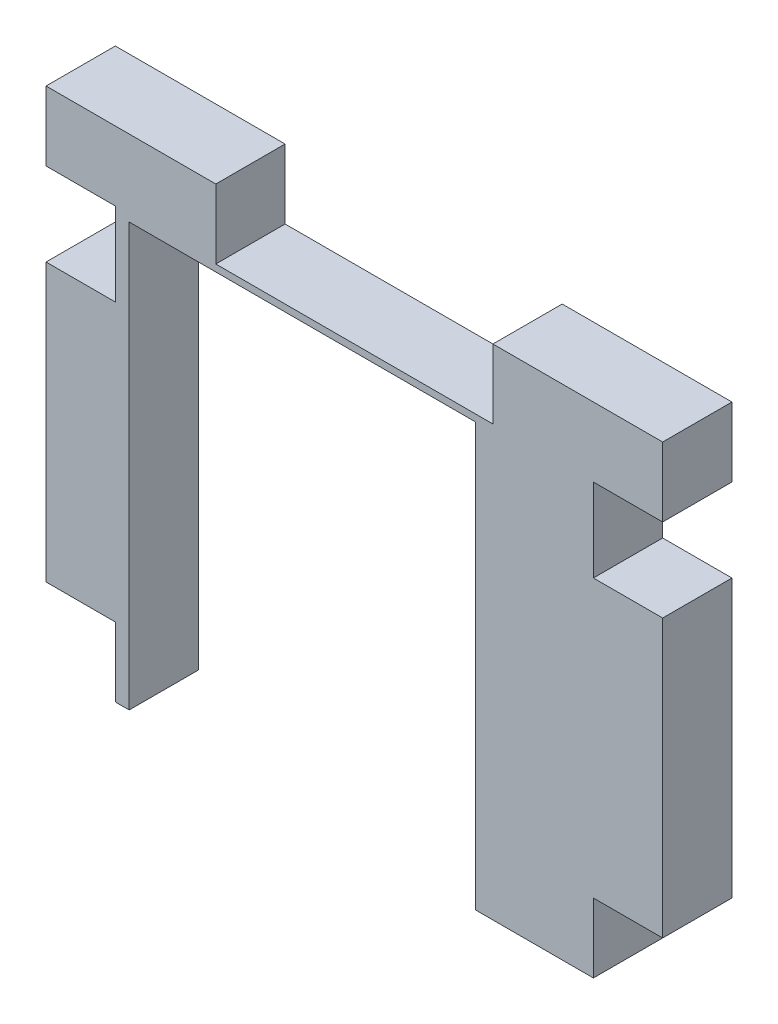
ISO-10303-21;
HEADER;
FILE_DESCRIPTION(('STEP AP214'),'2;1');
FILE_NAME('part.step','',(''),(''),'','','');
FILE_SCHEMA(('AUTOMOTIVE_DESIGN { 1 0 10303 214 1 1 1 1 }'));
ENDSEC;
DATA;
#1=APPLICATION_CONTEXT('core data for automotive mechanical design processes');
#2=APPLICATION_PROTOCOL_DEFINITION('international standard','automotive_design',2000,#1);
#3=PRODUCT_CONTEXT('',#1,'mechanical');
#4=PRODUCT('Part','Part','',(#3));
#5=PRODUCT_RELATED_PRODUCT_CATEGORY('part','',(#4));
#6=PRODUCT_DEFINITION_FORMATION('','',#4);
#7=PRODUCT_DEFINITION_CONTEXT('part definition',#1,'design');
#8=PRODUCT_DEFINITION('design','',#6,#7);
#9=PRODUCT_DEFINITION_SHAPE('','',#8);
#10=(LENGTH_UNIT() NAMED_UNIT(*) SI_UNIT(.MILLI.,.METRE.));
#11=(NAMED_UNIT(*) PLANE_ANGLE_UNIT() SI_UNIT($,.RADIAN.));
#12=(NAMED_UNIT(*) SI_UNIT($,.STERADIAN.) SOLID_ANGLE_UNIT());
#13=UNCERTAINTY_MEASURE_WITH_UNIT(LENGTH_MEASURE(1.E-05),#10,'distance_accuracy_value','');
#14=(GEOMETRIC_REPRESENTATION_CONTEXT(3) GLOBAL_UNCERTAINTY_ASSIGNED_CONTEXT((#13)) GLOBAL_UNIT_ASSIGNED_CONTEXT((#10,
#11,#12)) REPRESENTATION_CONTEXT('',''));
#15=CARTESIAN_POINT('',(0.,0.,0.));
#16=DIRECTION('',(0.,0.,1.));
#17=DIRECTION('',(1.,0.,0.));
#18=AXIS2_PLACEMENT_3D('',#15,#16,#17);
#19=CARTESIAN_POINT('',(0.,10.,5.));
#20=DIRECTION('',(0.,1.,0.));
#21=DIRECTION('',(0.,0.,1.));
#22=AXIS2_PLACEMENT_3D('',#19,#20,#21);
#23=PLANE('',#22);
#24=DIRECTION('',(1.,0.,0.));
#25=VECTOR('',#24,1.);
#26=CARTESIAN_POINT('',(0.,10.,0.));
#27=LINE('',#26,#25);
#28=CARTESIAN_POINT('',(0.,10.,0.));
#29=VERTEX_POINT('',#28);
#30=CARTESIAN_POINT('',(5.,10.,0.));
#31=VERTEX_POINT('',#30);
#32=EDGE_CURVE('E227',#29,#31,#27,.T.);
#33=ORIENTED_EDGE('',*,*,#32,.T.);
#34=DIRECTION('',(0.,0.,-1.));
#35=VECTOR('',#34,1.);
#36=CARTESIAN_POINT('',(5.,10.,5.));
#37=LINE('',#36,#35);
#38=CARTESIAN_POINT('',(5.,10.,5.));
#39=VERTEX_POINT('',#38);
#40=EDGE_CURVE('E11',#39,#31,#37,.T.);
#41=ORIENTED_EDGE('',*,*,#40,.F.);
#42=DIRECTION('',(1.,0.,0.));
#43=VECTOR('',#42,1.);
#44=CARTESIAN_POINT('',(0.,10.,5.));
#45=LINE('',#44,#43);
#46=CARTESIAN_POINT('',(0.,10.,5.));
#47=VERTEX_POINT('',#46);
#48=EDGE_CURVE('E289',#47,#39,#45,.T.);
#49=ORIENTED_EDGE('',*,*,#48,.F.);
#50=DIRECTION('',(0.,0.,-1.));
#51=VECTOR('',#50,1.);
#52=CARTESIAN_POINT('',(0.,10.,5.));
#53=LINE('',#52,#51);
#54=EDGE_CURVE('E50',#47,#29,#53,.T.);
#55=ORIENTED_EDGE('',*,*,#54,.T.);
#56=EDGE_LOOP('',(#33,#41,#49,#55));
#57=FACE_BOUND('',#56,.T.);
#58=ADVANCED_FACE('F34',(#57),#23,.F.);
#59=CARTESIAN_POINT('',(5.,0.,5.));
#60=DIRECTION('',(1.,0.,0.));
#61=DIRECTION('',(0.,0.,-1.));
#62=AXIS2_PLACEMENT_3D('',#59,#60,#61);
#63=PLANE('',#62);
#64=DIRECTION('',(0.,-1.,0.));
#65=VECTOR('',#64,1.);
#66=CARTESIAN_POINT('',(5.,0.,0.));
#67=LINE('',#66,#65);
#68=CARTESIAN_POINT('',(5.,5.,0.));
#69=VERTEX_POINT('',#68);
#70=EDGE_CURVE('E229',#31,#69,#67,.T.);
#71=ORIENTED_EDGE('',*,*,#70,.T.);
#72=DIRECTION('',(0.,0.,-1.));
#73=VECTOR('',#72,1.);
#74=CARTESIAN_POINT('',(5.,5.,5.));
#75=LINE('',#74,#73);
#76=CARTESIAN_POINT('',(5.,5.,5.));
#77=VERTEX_POINT('',#76);
#78=EDGE_CURVE('E42',#77,#69,#75,.T.);
#79=ORIENTED_EDGE('',*,*,#78,.F.);
#80=DIRECTION('',(0.,-1.,0.));
#81=VECTOR('',#80,1.);
#82=CARTESIAN_POINT('',(5.,0.,5.));
#83=LINE('',#82,#81);
#84=EDGE_CURVE('E136',#39,#77,#83,.T.);
#85=ORIENTED_EDGE('',*,*,#84,.F.);
#86=ORIENTED_EDGE('',*,*,#40,.T.);
#87=EDGE_LOOP('',(#71,#79,#85,#86));
#88=FACE_BOUND('',#87,.T.);
#89=ADVANCED_FACE('F406',(#88),#63,.F.);
#90=CARTESIAN_POINT('',(0.,5.,5.));
#91=DIRECTION('',(0.,1.,0.));
#92=DIRECTION('',(0.,0.,1.));
#93=AXIS2_PLACEMENT_3D('',#90,#91,#92);
#94=PLANE('',#93);
#95=DIRECTION('',(1.,0.,0.));
#96=VECTOR('',#95,1.);
#97=CARTESIAN_POINT('',(0.,5.,0.));
#98=LINE('',#97,#96);
#99=CARTESIAN_POINT('',(6.00000000000001,5.,0.));
#100=VERTEX_POINT('',#99);
#101=EDGE_CURVE('E231',#69,#100,#98,.T.);
#102=ORIENTED_EDGE('',*,*,#101,.T.);
#103=DIRECTION('',(0.,0.,-1.));
#104=VECTOR('',#103,1.);
#105=CARTESIAN_POINT('',(6.00000000000001,5.,5.));
#106=LINE('',#105,#104);
#107=CARTESIAN_POINT('',(6.00000000000001,5.,5.));
#108=VERTEX_POINT('',#107);
#109=EDGE_CURVE('E330',#108,#100,#106,.T.);
#110=ORIENTED_EDGE('',*,*,#109,.F.);
#111=DIRECTION('',(1.,0.,0.));
#112=VECTOR('',#111,1.);
#113=CARTESIAN_POINT('',(0.,5.,5.));
#114=LINE('',#113,#112);
#115=EDGE_CURVE('E337',#77,#108,#114,.T.);
#116=ORIENTED_EDGE('',*,*,#115,.F.);
#117=ORIENTED_EDGE('',*,*,#78,.T.);
#118=EDGE_LOOP('',(#102,#110,#116,#117));
#119=FACE_BOUND('',#118,.T.);
#120=ADVANCED_FACE('F335',(#119),#94,.F.);
#121=CARTESIAN_POINT('',(6.00000000000001,0.,5.));
#122=DIRECTION('',(1.,0.,0.));
#123=DIRECTION('',(0.,1.,0.));
#124=AXIS2_PLACEMENT_3D('',#121,#122,#123);
#125=PLANE('',#124);
#126=DIRECTION('',(0.,-1.,0.));
#127=VECTOR('',#126,1.);
#128=CARTESIAN_POINT('',(6.00000000000001,0.,0.));
#129=LINE('',#128,#127);
#130=CARTESIAN_POINT('',(6.,35.5,0.));
#131=VERTEX_POINT('',#130);
#132=EDGE_CURVE('E234',#131,#100,#129,.T.);
#133=ORIENTED_EDGE('',*,*,#132,.F.);
#134=DIRECTION('',(0.,0.,-1.));
#135=VECTOR('',#134,1.);
#136=CARTESIAN_POINT('',(6.,35.5,5.));
#137=LINE('',#136,#135);
#138=CARTESIAN_POINT('',(6.,35.5,5.));
#139=VERTEX_POINT('',#138);
#140=EDGE_CURVE('E328',#139,#131,#137,.T.);
#141=ORIENTED_EDGE('',*,*,#140,.F.);
#142=DIRECTION('',(0.,-1.,0.));
#143=VECTOR('',#142,1.);
#144=CARTESIAN_POINT('',(6.00000000000001,0.,5.));
#145=LINE('',#144,#143);
#146=EDGE_CURVE('E347',#139,#108,#145,.T.);
#147=ORIENTED_EDGE('',*,*,#146,.T.);
#148=ORIENTED_EDGE('',*,*,#109,.T.);
#149=EDGE_LOOP('',(#133,#141,#147,#148));
#150=FACE_BOUND('',#149,.T.);
#151=ADVANCED_FACE('F344',(#150),#125,.T.);
#152=CARTESIAN_POINT('',(0.,35.5,5.));
#153=DIRECTION('',(0.,-1.,0.));
#154=DIRECTION('',(1.,0.,0.));
#155=AXIS2_PLACEMENT_3D('',#152,#153,#154);
#156=PLANE('',#155);
#157=DIRECTION('',(-1.,0.,0.));
#158=VECTOR('',#157,1.);
#159=CARTESIAN_POINT('',(0.,35.5,0.));
#160=LINE('',#159,#158);
#161=CARTESIAN_POINT('',(31.,35.5,0.));
#162=VERTEX_POINT('',#161);
#163=EDGE_CURVE('E237',#162,#131,#160,.T.);
#164=ORIENTED_EDGE('',*,*,#163,.F.);
#165=DIRECTION('',(0.,0.,-1.));
#166=VECTOR('',#165,1.);
#167=CARTESIAN_POINT('',(31.,35.5,5.));
#168=LINE('',#167,#166);
#169=CARTESIAN_POINT('',(31.,35.5,5.));
#170=VERTEX_POINT('',#169);
#171=EDGE_CURVE('E326',#170,#162,#168,.T.);
#172=ORIENTED_EDGE('',*,*,#171,.F.);
#173=DIRECTION('',(-1.,0.,0.));
#174=VECTOR('',#173,1.);
#175=CARTESIAN_POINT('',(0.,35.5,5.));
#176=LINE('',#175,#174);
#177=EDGE_CURVE('E350',#170,#139,#176,.T.);
#178=ORIENTED_EDGE('',*,*,#177,.T.);
#179=ORIENTED_EDGE('',*,*,#140,.T.);
#180=EDGE_LOOP('',(#164,#172,#178,#179));
#181=FACE_BOUND('',#180,.T.);
#182=ADVANCED_FACE('F419',(#181),#156,.T.);
#183=CARTESIAN_POINT('',(31.,0.,5.));
#184=DIRECTION('',(1.,0.,0.));
#185=DIRECTION('',(0.,0.,-1.));
#186=AXIS2_PLACEMENT_3D('',#183,#184,#185);
#187=PLANE('',#186);
#188=DIRECTION('',(0.,-1.,0.));
#189=VECTOR('',#188,1.);
#190=CARTESIAN_POINT('',(31.,0.,0.));
#191=LINE('',#190,#189);
#192=CARTESIAN_POINT('',(31.,5.,0.));
#193=VERTEX_POINT('',#192);
#194=EDGE_CURVE('E240',#162,#193,#191,.T.);
#195=ORIENTED_EDGE('',*,*,#194,.T.);
#196=DIRECTION('',(0.,0.,-1.));
#197=VECTOR('',#196,1.);
#198=CARTESIAN_POINT('',(31.,5.,5.));
#199=LINE('',#198,#197);
#200=CARTESIAN_POINT('',(31.,5.,5.));
#201=VERTEX_POINT('',#200);
#202=EDGE_CURVE('E323',#201,#193,#199,.T.);
#203=ORIENTED_EDGE('',*,*,#202,.F.);
#204=DIRECTION('',(0.,-1.,0.));
#205=VECTOR('',#204,1.);
#206=CARTESIAN_POINT('',(31.,0.,5.));
#207=LINE('',#206,#205);
#208=EDGE_CURVE('E352',#170,#201,#207,.T.);
#209=ORIENTED_EDGE('',*,*,#208,.F.);
#210=ORIENTED_EDGE('',*,*,#171,.T.);
#211=EDGE_LOOP('',(#195,#203,#209,#210));
#212=FACE_BOUND('',#211,.T.);
#213=ADVANCED_FACE('F422',(#212),#187,.F.);
#214=CARTESIAN_POINT('',(0.,5.,5.));
#215=DIRECTION('',(0.,1.,0.));
#216=DIRECTION('',(0.,0.,1.));
#217=AXIS2_PLACEMENT_3D('',#214,#215,#216);
#218=PLANE('',#217);
#219=DIRECTION('',(1.,0.,0.));
#220=VECTOR('',#219,1.);
#221=CARTESIAN_POINT('',(0.,5.,0.));
#222=LINE('',#221,#220);
#223=CARTESIAN_POINT('',(39.5,5.,0.));
#224=VERTEX_POINT('',#223);
#225=EDGE_CURVE('E242',#193,#224,#222,.T.);
#226=ORIENTED_EDGE('',*,*,#225,.T.);
#227=DIRECTION('',(0.,0.,-1.));
#228=VECTOR('',#227,1.);
#229=CARTESIAN_POINT('',(39.5,5.,5.));
#230=LINE('',#229,#228);
#231=CARTESIAN_POINT('',(39.5,5.,5.));
#232=VERTEX_POINT('',#231);
#233=EDGE_CURVE('E321',#232,#224,#230,.T.);
#234=ORIENTED_EDGE('',*,*,#233,.F.);
#235=DIRECTION('',(1.,0.,0.));
#236=VECTOR('',#235,1.);
#237=CARTESIAN_POINT('',(0.,5.,5.));
#238=LINE('',#237,#236);
#239=EDGE_CURVE('E358',#201,#232,#238,.T.);
#240=ORIENTED_EDGE('',*,*,#239,.F.);
#241=ORIENTED_EDGE('',*,*,#202,.T.);
#242=EDGE_LOOP('',(#226,#234,#240,#241));
#243=FACE_BOUND('',#242,.T.);
#244=ADVANCED_FACE('F426',(#243),#218,.F.);
#245=CARTESIAN_POINT('',(39.5,0.,5.));
#246=DIRECTION('',(1.,0.,0.));
#247=DIRECTION('',(0.,0.,-1.));
#248=AXIS2_PLACEMENT_3D('',#245,#246,#247);
#249=PLANE('',#248);
#250=DIRECTION('',(0.,-1.,0.));
#251=VECTOR('',#250,1.);
#252=CARTESIAN_POINT('',(39.5,0.,0.));
#253=LINE('',#252,#251);
#254=CARTESIAN_POINT('',(39.5,10.,0.));
#255=VERTEX_POINT('',#254);
#256=EDGE_CURVE('E245',#255,#224,#253,.T.);
#257=ORIENTED_EDGE('',*,*,#256,.F.);
#258=DIRECTION('',(0.,0.,-1.));
#259=VECTOR('',#258,1.);
#260=CARTESIAN_POINT('',(39.5,10.,5.));
#261=LINE('',#260,#259);
#262=CARTESIAN_POINT('',(39.5,10.,5.));
#263=VERTEX_POINT('',#262);
#264=EDGE_CURVE('E319',#263,#255,#261,.T.);
#265=ORIENTED_EDGE('',*,*,#264,.F.);
#266=DIRECTION('',(0.,-1.,0.));
#267=VECTOR('',#266,1.);
#268=CARTESIAN_POINT('',(39.5,0.,5.));
#269=LINE('',#268,#267);
#270=EDGE_CURVE('E360',#263,#232,#269,.T.);
#271=ORIENTED_EDGE('',*,*,#270,.T.);
#272=ORIENTED_EDGE('',*,*,#233,.T.);
#273=EDGE_LOOP('',(#257,#265,#271,#272));
#274=FACE_BOUND('',#273,.T.);
#275=ADVANCED_FACE('F430',(#274),#249,.T.);
#276=CARTESIAN_POINT('',(0.,10.,5.));
#277=DIRECTION('',(0.,-1.,0.));
#278=DIRECTION('',(0.,0.,-1.));
#279=AXIS2_PLACEMENT_3D('',#276,#277,#278);
#280=PLANE('',#279);
#281=DIRECTION('',(-1.,0.,0.));
#282=VECTOR('',#281,1.);
#283=CARTESIAN_POINT('',(0.,10.,0.));
#284=LINE('',#283,#282);
#285=CARTESIAN_POINT('',(44.5,10.,0.));
#286=VERTEX_POINT('',#285);
#287=EDGE_CURVE('E248',#286,#255,#284,.T.);
#288=ORIENTED_EDGE('',*,*,#287,.F.);
#289=DIRECTION('',(0.,0.,-1.));
#290=VECTOR('',#289,1.);
#291=CARTESIAN_POINT('',(44.5,10.,5.));
#292=LINE('',#291,#290);
#293=CARTESIAN_POINT('',(44.5,10.,5.));
#294=VERTEX_POINT('',#293);
#295=EDGE_CURVE('E317',#294,#286,#292,.T.);
#296=ORIENTED_EDGE('',*,*,#295,.F.);
#297=DIRECTION('',(-1.,0.,0.));
#298=VECTOR('',#297,1.);
#299=CARTESIAN_POINT('',(0.,10.,5.));
#300=LINE('',#299,#298);
#301=EDGE_CURVE('E363',#294,#263,#300,.T.);
#302=ORIENTED_EDGE('',*,*,#301,.T.);
#303=ORIENTED_EDGE('',*,*,#264,.T.);
#304=EDGE_LOOP('',(#288,#296,#302,#303));
#305=FACE_BOUND('',#304,.T.);
#306=ADVANCED_FACE('F432',(#305),#280,.T.);
#307=CARTESIAN_POINT('',(44.5,0.,5.));
#308=DIRECTION('',(-1.,0.,0.));
#309=DIRECTION('',(0.,0.,1.));
#310=AXIS2_PLACEMENT_3D('',#307,#308,#309);
#311=PLANE('',#310);
#312=DIRECTION('',(0.,1.,0.));
#313=VECTOR('',#312,1.);
#314=CARTESIAN_POINT('',(44.5,0.,0.));
#315=LINE('',#314,#313);
#316=CARTESIAN_POINT('',(44.5,30.,0.));
#317=VERTEX_POINT('',#316);
#318=EDGE_CURVE('E252',#286,#317,#315,.T.);
#319=ORIENTED_EDGE('',*,*,#318,.T.);
#320=DIRECTION('',(0.,0.,-1.));
#321=VECTOR('',#320,1.);
#322=CARTESIAN_POINT('',(44.5,30.,5.));
#323=LINE('',#322,#321);
#324=CARTESIAN_POINT('',(44.5,30.,5.));
#325=VERTEX_POINT('',#324);
#326=EDGE_CURVE('E314',#325,#317,#323,.T.);
#327=ORIENTED_EDGE('',*,*,#326,.F.);
#328=DIRECTION('',(0.,1.,0.));
#329=VECTOR('',#328,1.);
#330=CARTESIAN_POINT('',(44.5,0.,5.));
#331=LINE('',#330,#329);
#332=EDGE_CURVE('E367',#294,#325,#331,.T.);
#333=ORIENTED_EDGE('',*,*,#332,.F.);
#334=ORIENTED_EDGE('',*,*,#295,.T.);
#335=EDGE_LOOP('',(#319,#327,#333,#334));
#336=FACE_BOUND('',#335,.T.);
#337=ADVANCED_FACE('F435',(#336),#311,.F.);
#338=CARTESIAN_POINT('',(0.,30.,5.));
#339=DIRECTION('',(0.,-1.,0.));
#340=DIRECTION('',(0.,0.,-1.));
#341=AXIS2_PLACEMENT_3D('',#338,#339,#340);
#342=PLANE('',#341);
#343=DIRECTION('',(-1.,0.,0.));
#344=VECTOR('',#343,1.);
#345=CARTESIAN_POINT('',(0.,30.,0.));
#346=LINE('',#345,#344);
#347=CARTESIAN_POINT('',(39.5,30.,0.));
#348=VERTEX_POINT('',#347);
#349=EDGE_CURVE('E254',#317,#348,#346,.T.);
#350=ORIENTED_EDGE('',*,*,#349,.T.);
#351=DIRECTION('',(0.,0.,-1.));
#352=VECTOR('',#351,1.);
#353=CARTESIAN_POINT('',(39.5,30.,5.));
#354=LINE('',#353,#352);
#355=CARTESIAN_POINT('',(39.5,30.,5.));
#356=VERTEX_POINT('',#355);
#357=EDGE_CURVE('E312',#356,#348,#354,.T.);
#358=ORIENTED_EDGE('',*,*,#357,.F.);
#359=DIRECTION('',(-1.,0.,0.));
#360=VECTOR('',#359,1.);
#361=CARTESIAN_POINT('',(0.,30.,5.));
#362=LINE('',#361,#360);
#363=EDGE_CURVE('E369',#325,#356,#362,.T.);
#364=ORIENTED_EDGE('',*,*,#363,.F.);
#365=ORIENTED_EDGE('',*,*,#326,.T.);
#366=EDGE_LOOP('',(#350,#358,#364,#365));
#367=FACE_BOUND('',#366,.T.);
#368=ADVANCED_FACE('F439',(#367),#342,.F.);
#369=CARTESIAN_POINT('',(39.5,36.,0.));
#370=VERTEX_POINT('',#369);
#371=EDGE_CURVE('E249',#370,#348,#253,.T.);
#372=ORIENTED_EDGE('',*,*,#371,.F.);
#373=DIRECTION('',(0.,0.,-1.));
#374=VECTOR('',#373,1.);
#375=CARTESIAN_POINT('',(39.5,36.,5.));
#376=LINE('',#375,#374);
#377=CARTESIAN_POINT('',(39.5,36.,5.));
#378=VERTEX_POINT('',#377);
#379=EDGE_CURVE('E310',#378,#370,#376,.T.);
#380=ORIENTED_EDGE('',*,*,#379,.F.);
#381=EDGE_CURVE('E364',#378,#356,#269,.T.);
#382=ORIENTED_EDGE('',*,*,#381,.T.);
#383=ORIENTED_EDGE('',*,*,#357,.T.);
#384=EDGE_LOOP('',(#372,#380,#382,#383));
#385=FACE_BOUND('',#384,.T.);
#386=ADVANCED_FACE('F443',(#385),#249,.T.);
#387=CARTESIAN_POINT('',(0.,36.,5.));
#388=DIRECTION('',(0.,1.,0.));
#389=DIRECTION('',(0.,0.,1.));
#390=AXIS2_PLACEMENT_3D('',#387,#388,#389);
#391=PLANE('',#390);
#392=DIRECTION('',(1.,0.,0.));
#393=VECTOR('',#392,1.);
#394=CARTESIAN_POINT('',(0.,36.,0.));
#395=LINE('',#394,#393);
#396=CARTESIAN_POINT('',(44.5,36.,0.));
#397=VERTEX_POINT('',#396);
#398=EDGE_CURVE('E257',#370,#397,#395,.T.);
#399=ORIENTED_EDGE('',*,*,#398,.T.);
#400=DIRECTION('',(0.,0.,-1.));
#401=VECTOR('',#400,1.);
#402=CARTESIAN_POINT('',(44.5,36.,5.));
#403=LINE('',#402,#401);
#404=CARTESIAN_POINT('',(44.5,36.,5.));
#405=VERTEX_POINT('',#404);
#406=EDGE_CURVE('E307',#405,#397,#403,.T.);
#407=ORIENTED_EDGE('',*,*,#406,.F.);
#408=DIRECTION('',(1.,0.,0.));
#409=VECTOR('',#408,1.);
#410=CARTESIAN_POINT('',(0.,36.,5.));
#411=LINE('',#410,#409);
#412=EDGE_CURVE('E371',#378,#405,#411,.T.);
#413=ORIENTED_EDGE('',*,*,#412,.F.);
#414=ORIENTED_EDGE('',*,*,#379,.T.);
#415=EDGE_LOOP('',(#399,#407,#413,#414));
#416=FACE_BOUND('',#415,.T.);
#417=ADVANCED_FACE('F447',(#416),#391,.F.);
#418=CARTESIAN_POINT('',(44.5,0.,5.));
#419=DIRECTION('',(-1.,0.,0.));
#420=DIRECTION('',(0.,0.,1.));
#421=AXIS2_PLACEMENT_3D('',#418,#419,#420);
#422=PLANE('',#421);
#423=DIRECTION('',(0.,1.,0.));
#424=VECTOR('',#423,1.);
#425=CARTESIAN_POINT('',(44.5,0.,0.));
#426=LINE('',#425,#424);
#427=CARTESIAN_POINT('',(44.5,41.,0.));
#428=VERTEX_POINT('',#427);
#429=EDGE_CURVE('E259',#397,#428,#426,.T.);
#430=ORIENTED_EDGE('',*,*,#429,.T.);
#431=DIRECTION('',(0.,0.,-1.));
#432=VECTOR('',#431,1.);
#433=CARTESIAN_POINT('',(44.5,41.,5.));
#434=LINE('',#433,#432);
#435=CARTESIAN_POINT('',(44.5,41.,5.));
#436=VERTEX_POINT('',#435);
#437=EDGE_CURVE('E305',#436,#428,#434,.T.);
#438=ORIENTED_EDGE('',*,*,#437,.F.);
#439=DIRECTION('',(0.,1.,0.));
#440=VECTOR('',#439,1.);
#441=CARTESIAN_POINT('',(44.5,0.,5.));
#442=LINE('',#441,#440);
#443=EDGE_CURVE('E373',#405,#436,#442,.T.);
#444=ORIENTED_EDGE('',*,*,#443,.F.);
#445=ORIENTED_EDGE('',*,*,#406,.T.);
#446=EDGE_LOOP('',(#430,#438,#444,#445));
#447=FACE_BOUND('',#446,.T.);
#448=ADVANCED_FACE('F451',(#447),#422,.F.);
#449=CARTESIAN_POINT('',(0.,41.,5.));
#450=DIRECTION('',(0.,1.,0.));
#451=DIRECTION('',(0.,0.,1.));
#452=AXIS2_PLACEMENT_3D('',#449,#450,#451);
#453=PLANE('',#452);
#454=DIRECTION('',(1.,0.,0.));
#455=VECTOR('',#454,1.);
#456=CARTESIAN_POINT('',(0.,41.,0.));
#457=LINE('',#456,#455);
#458=CARTESIAN_POINT('',(32.25,41.,0.));
#459=VERTEX_POINT('',#458);
#460=EDGE_CURVE('E262',#459,#428,#457,.T.);
#461=ORIENTED_EDGE('',*,*,#460,.F.);
#462=DIRECTION('',(0.,0.,-1.));
#463=VECTOR('',#462,1.);
#464=CARTESIAN_POINT('',(32.25,41.,5.));
#465=LINE('',#464,#463);
#466=CARTESIAN_POINT('',(32.25,41.,5.));
#467=VERTEX_POINT('',#466);
#468=EDGE_CURVE('E303',#467,#459,#465,.T.);
#469=ORIENTED_EDGE('',*,*,#468,.F.);
#470=DIRECTION('',(1.,0.,0.));
#471=VECTOR('',#470,1.);
#472=CARTESIAN_POINT('',(0.,41.,5.));
#473=LINE('',#472,#471);
#474=EDGE_CURVE('E375',#467,#436,#473,.T.);
#475=ORIENTED_EDGE('',*,*,#474,.T.);
#476=ORIENTED_EDGE('',*,*,#437,.T.);
#477=EDGE_LOOP('',(#461,#469,#475,#476));
#478=FACE_BOUND('',#477,.T.);
#479=ADVANCED_FACE('F455',(#478),#453,.T.);
#480=CARTESIAN_POINT('',(32.25,0.,5.));
#481=DIRECTION('',(1.,0.,0.));
#482=DIRECTION('',(0.,0.,-1.));
#483=AXIS2_PLACEMENT_3D('',#480,#481,#482);
#484=PLANE('',#483);
#485=DIRECTION('',(0.,-1.,0.));
#486=VECTOR('',#485,1.);
#487=CARTESIAN_POINT('',(32.25,0.,0.));
#488=LINE('',#487,#486);
#489=CARTESIAN_POINT('',(32.25,36.,0.));
#490=VERTEX_POINT('',#489);
#491=EDGE_CURVE('E265',#459,#490,#488,.T.);
#492=ORIENTED_EDGE('',*,*,#491,.T.);
#493=DIRECTION('',(0.,0.,-1.));
#494=VECTOR('',#493,1.);
#495=CARTESIAN_POINT('',(32.25,36.,5.));
#496=LINE('',#495,#494);
#497=CARTESIAN_POINT('',(32.25,36.,5.));
#498=VERTEX_POINT('',#497);
#499=EDGE_CURVE('E301',#498,#490,#496,.T.);
#500=ORIENTED_EDGE('',*,*,#499,.F.);
#501=DIRECTION('',(0.,-1.,0.));
#502=VECTOR('',#501,1.);
#503=CARTESIAN_POINT('',(32.25,0.,5.));
#504=LINE('',#503,#502);
#505=EDGE_CURVE('E378',#467,#498,#504,.T.);
#506=ORIENTED_EDGE('',*,*,#505,.F.);
#507=ORIENTED_EDGE('',*,*,#468,.T.);
#508=EDGE_LOOP('',(#492,#500,#506,#507));
#509=FACE_BOUND('',#508,.T.);
#510=ADVANCED_FACE('F459',(#509),#484,.F.);
#511=CARTESIAN_POINT('',(0.,36.,5.));
#512=DIRECTION('',(0.,1.,0.));
#513=DIRECTION('',(0.,0.,1.));
#514=AXIS2_PLACEMENT_3D('',#511,#512,#513);
#515=PLANE('',#514);
#516=DIRECTION('',(1.,0.,0.));
#517=VECTOR('',#516,1.);
#518=CARTESIAN_POINT('',(0.,36.,0.));
#519=LINE('',#518,#517);
#520=CARTESIAN_POINT('',(12.25,36.,0.));
#521=VERTEX_POINT('',#520);
#522=EDGE_CURVE('E268',#521,#490,#519,.T.);
#523=ORIENTED_EDGE('',*,*,#522,.F.);
#524=DIRECTION('',(0.,0.,-1.));
#525=VECTOR('',#524,1.);
#526=CARTESIAN_POINT('',(12.25,36.,5.));
#527=LINE('',#526,#525);
#528=CARTESIAN_POINT('',(12.25,36.,5.));
#529=VERTEX_POINT('',#528);
#530=EDGE_CURVE('E299',#529,#521,#527,.T.);
#531=ORIENTED_EDGE('',*,*,#530,.F.);
#532=DIRECTION('',(1.,0.,0.));
#533=VECTOR('',#532,1.);
#534=CARTESIAN_POINT('',(0.,36.,5.));
#535=LINE('',#534,#533);
#536=EDGE_CURVE('E380',#529,#498,#535,.T.);
#537=ORIENTED_EDGE('',*,*,#536,.T.);
#538=ORIENTED_EDGE('',*,*,#499,.T.);
#539=EDGE_LOOP('',(#523,#531,#537,#538));
#540=FACE_BOUND('',#539,.T.);
#541=ADVANCED_FACE('F463',(#540),#515,.T.);
#542=CARTESIAN_POINT('',(12.25,0.,5.));
#543=DIRECTION('',(1.,0.,0.));
#544=DIRECTION('',(0.,0.,-1.));
#545=AXIS2_PLACEMENT_3D('',#542,#543,#544);
#546=PLANE('',#545);
#547=DIRECTION('',(0.,-1.,0.));
#548=VECTOR('',#547,1.);
#549=CARTESIAN_POINT('',(12.25,0.,0.));
#550=LINE('',#549,#548);
#551=CARTESIAN_POINT('',(12.25,41.,0.));
#552=VERTEX_POINT('',#551);
#553=EDGE_CURVE('E271',#552,#521,#550,.T.);
#554=ORIENTED_EDGE('',*,*,#553,.F.);
#555=DIRECTION('',(0.,0.,-1.));
#556=VECTOR('',#555,1.);
#557=CARTESIAN_POINT('',(12.25,41.,5.));
#558=LINE('',#557,#556);
#559=CARTESIAN_POINT('',(12.25,41.,5.));
#560=VERTEX_POINT('',#559);
#561=EDGE_CURVE('E297',#560,#552,#558,.T.);
#562=ORIENTED_EDGE('',*,*,#561,.F.);
#563=DIRECTION('',(0.,-1.,0.));
#564=VECTOR('',#563,1.);
#565=CARTESIAN_POINT('',(12.25,0.,5.));
#566=LINE('',#565,#564);
#567=EDGE_CURVE('E383',#560,#529,#566,.T.);
#568=ORIENTED_EDGE('',*,*,#567,.T.);
#569=ORIENTED_EDGE('',*,*,#530,.T.);
#570=EDGE_LOOP('',(#554,#562,#568,#569));
#571=FACE_BOUND('',#570,.T.);
#572=ADVANCED_FACE('F467',(#571),#546,.T.);
#573=CARTESIAN_POINT('',(0.,41.,5.));
#574=DIRECTION('',(0.,1.,0.));
#575=DIRECTION('',(0.,0.,1.));
#576=AXIS2_PLACEMENT_3D('',#573,#574,#575);
#577=PLANE('',#576);
#578=DIRECTION('',(1.,0.,0.));
#579=VECTOR('',#578,1.);
#580=CARTESIAN_POINT('',(0.,41.,0.));
#581=LINE('',#580,#579);
#582=CARTESIAN_POINT('',(0.,41.,0.));
#583=VERTEX_POINT('',#582);
#584=EDGE_CURVE('E274',#583,#552,#581,.T.);
#585=ORIENTED_EDGE('',*,*,#584,.F.);
#586=DIRECTION('',(0.,0.,-1.));
#587=VECTOR('',#586,1.);
#588=CARTESIAN_POINT('',(0.,41.,5.));
#589=LINE('',#588,#587);
#590=CARTESIAN_POINT('',(0.,41.,5.));
#591=VERTEX_POINT('',#590);
#592=EDGE_CURVE('E295',#591,#583,#589,.T.);
#593=ORIENTED_EDGE('',*,*,#592,.F.);
#594=DIRECTION('',(1.,0.,0.));
#595=VECTOR('',#594,1.);
#596=CARTESIAN_POINT('',(0.,41.,5.));
#597=LINE('',#596,#595);
#598=EDGE_CURVE('E386',#591,#560,#597,.T.);
#599=ORIENTED_EDGE('',*,*,#598,.T.);
#600=ORIENTED_EDGE('',*,*,#561,.T.);
#601=EDGE_LOOP('',(#585,#593,#599,#600));
#602=FACE_BOUND('',#601,.T.);
#603=ADVANCED_FACE('F471',(#602),#577,.T.);
#604=CARTESIAN_POINT('',(0.,0.,5.));
#605=DIRECTION('',(-1.,0.,0.));
#606=DIRECTION('',(0.,0.,1.));
#607=AXIS2_PLACEMENT_3D('',#604,#605,#606);
#608=PLANE('',#607);
#609=DIRECTION('',(0.,1.,0.));
#610=VECTOR('',#609,1.);
#611=CARTESIAN_POINT('',(0.,0.,0.));
#612=LINE('',#611,#610);
#613=CARTESIAN_POINT('',(0.,36.,0.));
#614=VERTEX_POINT('',#613);
#615=EDGE_CURVE('E277',#614,#583,#612,.T.);
#616=ORIENTED_EDGE('',*,*,#615,.F.);
#617=DIRECTION('',(0.,0.,-1.));
#618=VECTOR('',#617,1.);
#619=CARTESIAN_POINT('',(0.,36.,5.));
#620=LINE('',#619,#618);
#621=CARTESIAN_POINT('',(0.,36.,5.));
#622=VERTEX_POINT('',#621);
#623=EDGE_CURVE('E293',#622,#614,#620,.T.);
#624=ORIENTED_EDGE('',*,*,#623,.F.);
#625=DIRECTION('',(0.,1.,0.));
#626=VECTOR('',#625,1.);
#627=CARTESIAN_POINT('',(0.,0.,5.));
#628=LINE('',#627,#626);
#629=EDGE_CURVE('E389',#622,#591,#628,.T.);
#630=ORIENTED_EDGE('',*,*,#629,.T.);
#631=ORIENTED_EDGE('',*,*,#592,.T.);
#632=EDGE_LOOP('',(#616,#624,#630,#631));
#633=FACE_BOUND('',#632,.T.);
#634=ADVANCED_FACE('F475',(#633),#608,.T.);
#635=CARTESIAN_POINT('',(0.,36.,5.));
#636=DIRECTION('',(0.,-1.,0.));
#637=DIRECTION('',(0.,0.,-1.));
#638=AXIS2_PLACEMENT_3D('',#635,#636,#637);
#639=PLANE('',#638);
#640=DIRECTION('',(-1.,0.,0.));
#641=VECTOR('',#640,1.);
#642=CARTESIAN_POINT('',(0.,36.,0.));
#643=LINE('',#642,#641);
#644=CARTESIAN_POINT('',(5.,36.,0.));
#645=VERTEX_POINT('',#644);
#646=EDGE_CURVE('E280',#645,#614,#643,.T.);
#647=ORIENTED_EDGE('',*,*,#646,.F.);
#648=DIRECTION('',(0.,0.,-1.));
#649=VECTOR('',#648,1.);
#650=CARTESIAN_POINT('',(5.,36.,5.));
#651=LINE('',#650,#649);
#652=CARTESIAN_POINT('',(5.,36.,5.));
#653=VERTEX_POINT('',#652);
#654=EDGE_CURVE('E219',#653,#645,#651,.T.);
#655=ORIENTED_EDGE('',*,*,#654,.F.);
#656=DIRECTION('',(-1.,0.,0.));
#657=VECTOR('',#656,1.);
#658=CARTESIAN_POINT('',(0.,36.,5.));
#659=LINE('',#658,#657);
#660=EDGE_CURVE('E209',#653,#622,#659,.T.);
#661=ORIENTED_EDGE('',*,*,#660,.T.);
#662=ORIENTED_EDGE('',*,*,#623,.T.);
#663=EDGE_LOOP('',(#647,#655,#661,#662));
#664=FACE_BOUND('',#663,.T.);
#665=ADVANCED_FACE('F393',(#664),#639,.T.);
#666=CARTESIAN_POINT('',(5.,0.,5.));
#667=DIRECTION('',(1.,0.,0.));
#668=DIRECTION('',(0.,0.,-1.));
#669=AXIS2_PLACEMENT_3D('',#666,#667,#668);
#670=PLANE('',#669);
#671=DIRECTION('',(0.,-1.,0.));
#672=VECTOR('',#671,1.);
#673=CARTESIAN_POINT('',(5.,0.,0.));
#674=LINE('',#673,#672);
#675=CARTESIAN_POINT('',(5.,30.,0.));
#676=VERTEX_POINT('',#675);
#677=EDGE_CURVE('E216',#645,#676,#674,.T.);
#678=ORIENTED_EDGE('',*,*,#677,.T.);
#679=DIRECTION('',(0.,0.,-1.));
#680=VECTOR('',#679,1.);
#681=CARTESIAN_POINT('',(5.,30.,5.));
#682=LINE('',#681,#680);
#683=CARTESIAN_POINT('',(5.,30.,5.));
#684=VERTEX_POINT('',#683);
#685=EDGE_CURVE('E213',#684,#676,#682,.T.);
#686=ORIENTED_EDGE('',*,*,#685,.F.);
#687=DIRECTION('',(0.,-1.,0.));
#688=VECTOR('',#687,1.);
#689=CARTESIAN_POINT('',(5.,0.,5.));
#690=LINE('',#689,#688);
#691=EDGE_CURVE('E201',#653,#684,#690,.T.);
#692=ORIENTED_EDGE('',*,*,#691,.F.);
#693=ORIENTED_EDGE('',*,*,#654,.T.);
#694=EDGE_LOOP('',(#678,#686,#692,#693));
#695=FACE_BOUND('',#694,.T.);
#696=ADVANCED_FACE('F214',(#695),#670,.F.);
#697=CARTESIAN_POINT('',(0.,30.,5.));
#698=DIRECTION('',(0.,1.,0.));
#699=DIRECTION('',(0.,0.,1.));
#700=AXIS2_PLACEMENT_3D('',#697,#698,#699);
#701=PLANE('',#700);
#702=DIRECTION('',(1.,0.,0.));
#703=VECTOR('',#702,1.);
#704=CARTESIAN_POINT('',(0.,30.,0.));
#705=LINE('',#704,#703);
#706=CARTESIAN_POINT('',(0.,30.,0.));
#707=VERTEX_POINT('',#706);
#708=EDGE_CURVE('E284',#707,#676,#705,.T.);
#709=ORIENTED_EDGE('',*,*,#708,.F.);
#710=DIRECTION('',(0.,0.,-1.));
#711=VECTOR('',#710,1.);
#712=CARTESIAN_POINT('',(0.,30.,5.));
#713=LINE('',#712,#711);
#714=CARTESIAN_POINT('',(0.,30.,5.));
#715=VERTEX_POINT('',#714);
#716=EDGE_CURVE('E124',#715,#707,#713,.T.);
#717=ORIENTED_EDGE('',*,*,#716,.F.);
#718=DIRECTION('',(1.,0.,0.));
#719=VECTOR('',#718,1.);
#720=CARTESIAN_POINT('',(0.,30.,5.));
#721=LINE('',#720,#719);
#722=EDGE_CURVE('E206',#715,#684,#721,.T.);
#723=ORIENTED_EDGE('',*,*,#722,.T.);
#724=ORIENTED_EDGE('',*,*,#685,.T.);
#725=EDGE_LOOP('',(#709,#717,#723,#724));
#726=FACE_BOUND('',#725,.T.);
#727=ADVANCED_FACE('F221',(#726),#701,.T.);
#728=CARTESIAN_POINT('',(0.,0.,5.));
#729=DIRECTION('',(-1.,0.,0.));
#730=DIRECTION('',(0.,0.,1.));
#731=AXIS2_PLACEMENT_3D('',#728,#729,#730);
#732=PLANE('',#731);
#733=DIRECTION('',(0.,1.,0.));
#734=VECTOR('',#733,1.);
#735=CARTESIAN_POINT('',(0.,0.,0.));
#736=LINE('',#735,#734);
#737=EDGE_CURVE('E286',#29,#707,#736,.T.);
#738=ORIENTED_EDGE('',*,*,#737,.F.);
#739=ORIENTED_EDGE('',*,*,#54,.F.);
#740=DIRECTION('',(0.,1.,0.));
#741=VECTOR('',#740,1.);
#742=CARTESIAN_POINT('',(0.,0.,5.));
#743=LINE('',#742,#741);
#744=EDGE_CURVE('E222',#47,#715,#743,.T.);
#745=ORIENTED_EDGE('',*,*,#744,.T.);
#746=ORIENTED_EDGE('',*,*,#716,.T.);
#747=EDGE_LOOP('',(#738,#739,#745,#746));
#748=FACE_BOUND('',#747,.T.);
#749=ADVANCED_FACE('F395',(#748),#732,.T.);
#750=CARTESIAN_POINT('',(0.,0.,5.));
#751=DIRECTION('',(0.,0.,1.));
#752=DIRECTION('',(1.,0.,0.));
#753=AXIS2_PLACEMENT_3D('',#750,#751,#752);
#754=PLANE('',#753);
#755=ORIENTED_EDGE('',*,*,#48,.T.);
#756=ORIENTED_EDGE('',*,*,#84,.T.);
#757=ORIENTED_EDGE('',*,*,#115,.T.);
#758=ORIENTED_EDGE('',*,*,#146,.F.);
#759=ORIENTED_EDGE('',*,*,#177,.F.);
#760=ORIENTED_EDGE('',*,*,#208,.T.);
#761=ORIENTED_EDGE('',*,*,#239,.T.);
#762=ORIENTED_EDGE('',*,*,#270,.F.);
#763=ORIENTED_EDGE('',*,*,#301,.F.);
#764=ORIENTED_EDGE('',*,*,#332,.T.);
#765=ORIENTED_EDGE('',*,*,#363,.T.);
#766=ORIENTED_EDGE('',*,*,#381,.F.);
#767=ORIENTED_EDGE('',*,*,#412,.T.);
#768=ORIENTED_EDGE('',*,*,#443,.T.);
#769=ORIENTED_EDGE('',*,*,#474,.F.);
#770=ORIENTED_EDGE('',*,*,#505,.T.);
#771=ORIENTED_EDGE('',*,*,#536,.F.);
#772=ORIENTED_EDGE('',*,*,#567,.F.);
#773=ORIENTED_EDGE('',*,*,#598,.F.);
#774=ORIENTED_EDGE('',*,*,#629,.F.);
#775=ORIENTED_EDGE('',*,*,#660,.F.);
#776=ORIENTED_EDGE('',*,*,#691,.T.);
#777=ORIENTED_EDGE('',*,*,#722,.F.);
#778=ORIENTED_EDGE('',*,*,#744,.F.);
#779=EDGE_LOOP('',(#755,#756,#757,#758,#759,#760,#761,#762,#763,#764,#765,#766,#767,#768,#769,
#770,#771,#772,#773,#774,#775,#776,#777,#778));
#780=FACE_BOUND('',#779,.T.);
#781=ADVANCED_FACE('F203',(#780),#754,.T.);
#782=CARTESIAN_POINT('',(0.,0.,0.));
#783=DIRECTION('',(0.,0.,1.));
#784=DIRECTION('',(1.,0.,0.));
#785=AXIS2_PLACEMENT_3D('',#782,#783,#784);
#786=PLANE('',#785);
#787=ORIENTED_EDGE('',*,*,#32,.F.);
#788=ORIENTED_EDGE('',*,*,#737,.T.);
#789=ORIENTED_EDGE('',*,*,#708,.T.);
#790=ORIENTED_EDGE('',*,*,#677,.F.);
#791=ORIENTED_EDGE('',*,*,#646,.T.);
#792=ORIENTED_EDGE('',*,*,#615,.T.);
#793=ORIENTED_EDGE('',*,*,#584,.T.);
#794=ORIENTED_EDGE('',*,*,#553,.T.);
#795=ORIENTED_EDGE('',*,*,#522,.T.);
#796=ORIENTED_EDGE('',*,*,#491,.F.);
#797=ORIENTED_EDGE('',*,*,#460,.T.);
#798=ORIENTED_EDGE('',*,*,#429,.F.);
#799=ORIENTED_EDGE('',*,*,#398,.F.);
#800=ORIENTED_EDGE('',*,*,#371,.T.);
#801=ORIENTED_EDGE('',*,*,#349,.F.);
#802=ORIENTED_EDGE('',*,*,#318,.F.);
#803=ORIENTED_EDGE('',*,*,#287,.T.);
#804=ORIENTED_EDGE('',*,*,#256,.T.);
#805=ORIENTED_EDGE('',*,*,#225,.F.);
#806=ORIENTED_EDGE('',*,*,#194,.F.);
#807=ORIENTED_EDGE('',*,*,#163,.T.);
#808=ORIENTED_EDGE('',*,*,#132,.T.);
#809=ORIENTED_EDGE('',*,*,#101,.F.);
#810=ORIENTED_EDGE('',*,*,#70,.F.);
#811=EDGE_LOOP('',(#787,#788,#789,#790,#791,#792,#793,#794,#795,#796,#797,#798,#799,#800,#801,
#802,#803,#804,#805,#806,#807,#808,#809,#810));
#812=FACE_BOUND('',#811,.T.);
#813=ADVANCED_FACE('F339',(#812),#786,.F.);
#814=CLOSED_SHELL('',(#58,#89,#120,#151,#182,#213,#244,#275,#306,#337,#368,#386,#417,#448,#479,
#510,#541,#572,#603,#634,#665,#696,#727,#749,#781,#813));
#815=MANIFOLD_SOLID_BREP('B2',#814);
#816=ADVANCED_BREP_SHAPE_REPRESENTATION('',(#18,#815),#14);
#817=SHAPE_DEFINITION_REPRESENTATION(#9,#816);
ENDSEC;
END-ISO-10303-21;
